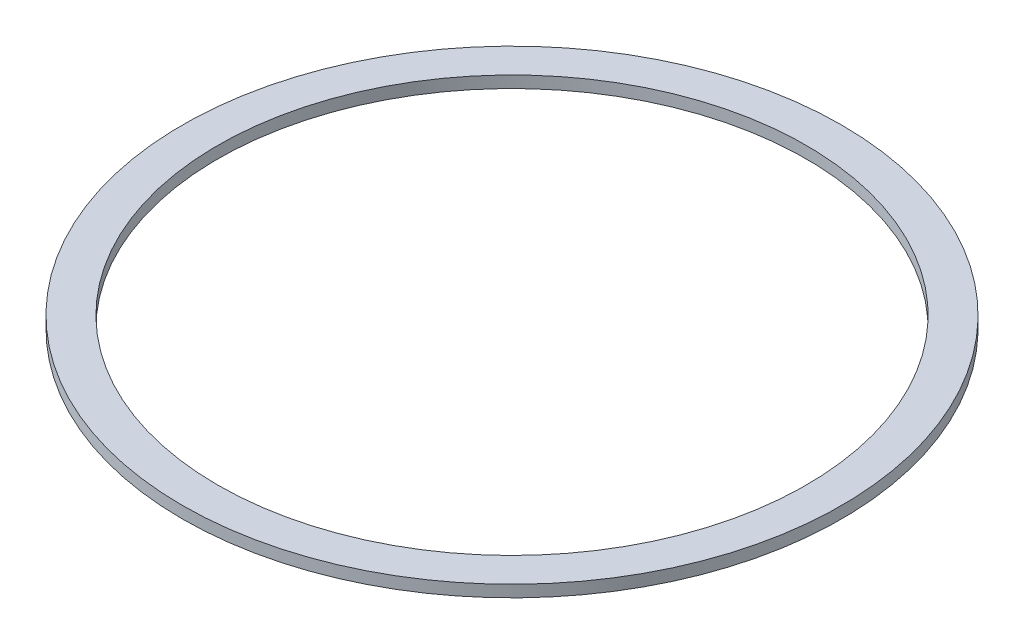
ISO-10303-21;
HEADER;
FILE_DESCRIPTION(('STEP AP214'),'2;1');
FILE_NAME('part.step','',(''),(''),'','','');
FILE_SCHEMA(('AUTOMOTIVE_DESIGN { 1 0 10303 214 1 1 1 1 }'));
ENDSEC;
DATA;
#1=APPLICATION_CONTEXT('core data for automotive mechanical design processes');
#2=APPLICATION_PROTOCOL_DEFINITION('international standard','automotive_design',2000,#1);
#3=PRODUCT_CONTEXT('',#1,'mechanical');
#4=PRODUCT('Part','Part','',(#3));
#5=PRODUCT_RELATED_PRODUCT_CATEGORY('part','',(#4));
#6=PRODUCT_DEFINITION_FORMATION('','',#4);
#7=PRODUCT_DEFINITION_CONTEXT('part definition',#1,'design');
#8=PRODUCT_DEFINITION('design','',#6,#7);
#9=PRODUCT_DEFINITION_SHAPE('','',#8);
#10=(LENGTH_UNIT() NAMED_UNIT(*) SI_UNIT(.MILLI.,.METRE.));
#11=(NAMED_UNIT(*) PLANE_ANGLE_UNIT() SI_UNIT($,.RADIAN.));
#12=(NAMED_UNIT(*) SI_UNIT($,.STERADIAN.) SOLID_ANGLE_UNIT());
#13=UNCERTAINTY_MEASURE_WITH_UNIT(LENGTH_MEASURE(1.E-05),#10,'distance_accuracy_value','');
#14=(GEOMETRIC_REPRESENTATION_CONTEXT(3) GLOBAL_UNCERTAINTY_ASSIGNED_CONTEXT((#13)) GLOBAL_UNIT_ASSIGNED_CONTEXT((#10,
#11,#12)) REPRESENTATION_CONTEXT('',''));
#15=CARTESIAN_POINT('',(0.,0.,0.));
#16=DIRECTION('',(0.,0.,1.));
#17=DIRECTION('',(1.,0.,0.));
#18=AXIS2_PLACEMENT_3D('',#15,#16,#17);
#19=CARTESIAN_POINT('',(0.,1.,0.));
#20=DIRECTION('',(0.,1.,0.));
#21=DIRECTION('',(0.,0.,1.));
#22=AXIS2_PLACEMENT_3D('',#19,#20,#21);
#23=PLANE('',#22);
#24=CARTESIAN_POINT('',(0.,1.,0.));
#25=DIRECTION('',(0.,1.,0.));
#26=DIRECTION('',(0.,0.,1.));
#27=AXIS2_PLACEMENT_3D('',#24,#25,#26);
#28=CIRCLE('',#27,28.);
#29=CARTESIAN_POINT('',(0.,1.,28.));
#30=VERTEX_POINT('',#29);
#31=EDGE_CURVE('E10',#30,#30,#28,.T.);
#32=ORIENTED_EDGE('',*,*,#31,.T.);
#33=EDGE_LOOP('',(#32));
#34=FACE_BOUND('',#33,.T.);
#35=CARTESIAN_POINT('',(0.,1.,0.));
#36=DIRECTION('',(0.,1.,0.));
#37=DIRECTION('',(0.,0.,1.));
#38=AXIS2_PLACEMENT_3D('',#35,#36,#37);
#39=CIRCLE('',#38,25.);
#40=CARTESIAN_POINT('',(0.,1.,25.));
#41=VERTEX_POINT('',#40);
#42=EDGE_CURVE('E48',#41,#41,#39,.T.);
#43=ORIENTED_EDGE('',*,*,#42,.F.);
#44=EDGE_LOOP('',(#43));
#45=FACE_BOUND('',#44,.T.);
#46=ADVANCED_FACE('F37',(#34,#45),#23,.T.);
#47=CARTESIAN_POINT('',(0.,0.,0.));
#48=DIRECTION('',(0.,1.,0.));
#49=DIRECTION('',(0.,0.,1.));
#50=AXIS2_PLACEMENT_3D('',#47,#48,#49);
#51=PLANE('',#50);
#52=CARTESIAN_POINT('',(0.,0.,0.));
#53=DIRECTION('',(0.,1.,0.));
#54=DIRECTION('',(0.,0.,1.));
#55=AXIS2_PLACEMENT_3D('',#52,#53,#54);
#56=CIRCLE('',#55,28.);
#57=CARTESIAN_POINT('',(0.,0.,28.));
#58=VERTEX_POINT('',#57);
#59=EDGE_CURVE('E41',#58,#58,#56,.T.);
#60=ORIENTED_EDGE('',*,*,#59,.F.);
#61=EDGE_LOOP('',(#60));
#62=FACE_BOUND('',#61,.T.);
#63=CARTESIAN_POINT('',(0.,0.,0.));
#64=DIRECTION('',(0.,1.,0.));
#65=DIRECTION('',(0.,0.,1.));
#66=AXIS2_PLACEMENT_3D('',#63,#64,#65);
#67=CIRCLE('',#66,25.);
#68=CARTESIAN_POINT('',(0.,0.,25.));
#69=VERTEX_POINT('',#68);
#70=EDGE_CURVE('E50',#69,#69,#67,.T.);
#71=ORIENTED_EDGE('',*,*,#70,.T.);
#72=EDGE_LOOP('',(#71));
#73=FACE_BOUND('',#72,.T.);
#74=ADVANCED_FACE('F60',(#62,#73),#51,.F.);
#75=CARTESIAN_POINT('',(0.,1.,0.));
#76=DIRECTION('',(0.,-1.,0.));
#77=DIRECTION('',(0.,0.,-1.));
#78=AXIS2_PLACEMENT_3D('',#75,#76,#77);
#79=CYLINDRICAL_SURFACE('',#78,28.);
#80=ORIENTED_EDGE('',*,*,#31,.F.);
#81=EDGE_LOOP('',(#80));
#82=FACE_BOUND('',#81,.T.);
#83=ORIENTED_EDGE('',*,*,#59,.T.);
#84=EDGE_LOOP('',(#83));
#85=FACE_BOUND('',#84,.T.);
#86=ADVANCED_FACE('F39',(#82,#85),#79,.T.);
#87=CARTESIAN_POINT('',(0.,1.,0.));
#88=DIRECTION('',(0.,-1.,0.));
#89=DIRECTION('',(0.,0.,-1.));
#90=AXIS2_PLACEMENT_3D('',#87,#88,#89);
#91=CYLINDRICAL_SURFACE('',#90,25.);
#92=ORIENTED_EDGE('',*,*,#42,.T.);
#93=EDGE_LOOP('',(#92));
#94=FACE_BOUND('',#93,.T.);
#95=ORIENTED_EDGE('',*,*,#70,.F.);
#96=EDGE_LOOP('',(#95));
#97=FACE_BOUND('',#96,.T.);
#98=ADVANCED_FACE('F56',(#94,#97),#91,.F.);
#99=CLOSED_SHELL('',(#46,#74,#86,#98));
#100=MANIFOLD_SOLID_BREP('B2',#99);
#101=ADVANCED_BREP_SHAPE_REPRESENTATION('',(#18,#100),#14);
#102=SHAPE_DEFINITION_REPRESENTATION(#9,#101);
ENDSEC;
END-ISO-10303-21;
